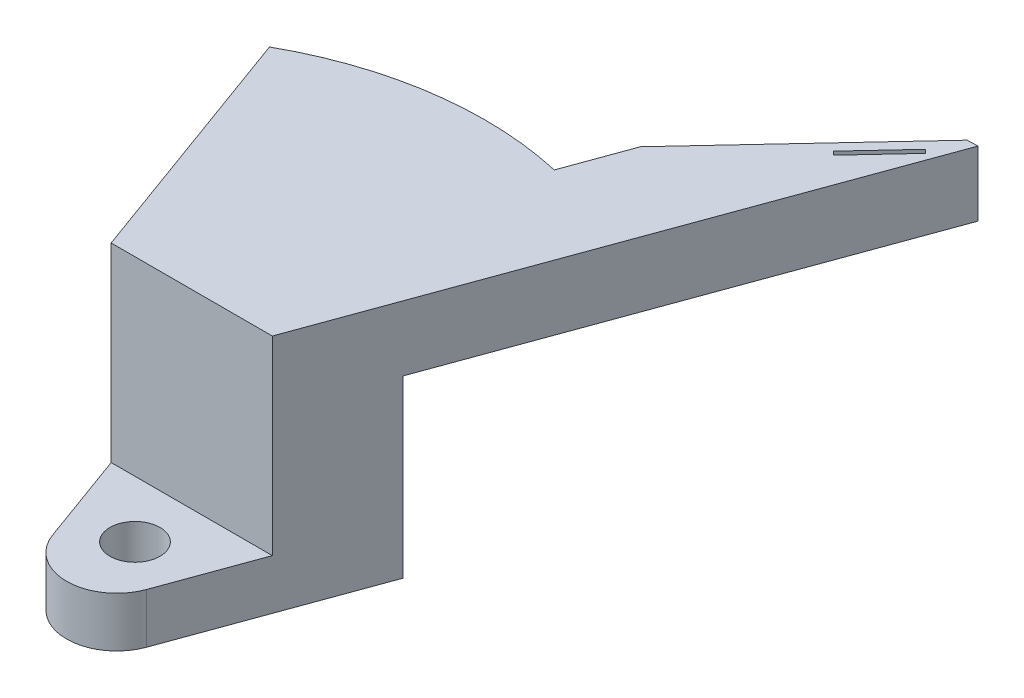
ISO-10303-21;
HEADER;
FILE_DESCRIPTION(('STEP AP214'),'2;1');
FILE_NAME('part.step','',(''),(''),'','','');
FILE_SCHEMA(('AUTOMOTIVE_DESIGN { 1 0 10303 214 1 1 1 1 }'));
ENDSEC;
DATA;
#1=APPLICATION_CONTEXT('core data for automotive mechanical design processes');
#2=APPLICATION_PROTOCOL_DEFINITION('international standard','automotive_design',2000,#1);
#3=PRODUCT_CONTEXT('',#1,'mechanical');
#4=PRODUCT('Part','Part','',(#3));
#5=PRODUCT_RELATED_PRODUCT_CATEGORY('part','',(#4));
#6=PRODUCT_DEFINITION_FORMATION('','',#4);
#7=PRODUCT_DEFINITION_CONTEXT('part definition',#1,'design');
#8=PRODUCT_DEFINITION('design','',#6,#7);
#9=PRODUCT_DEFINITION_SHAPE('','',#8);
#10=(LENGTH_UNIT() NAMED_UNIT(*) SI_UNIT(.MILLI.,.METRE.));
#11=(NAMED_UNIT(*) PLANE_ANGLE_UNIT() SI_UNIT($,.RADIAN.));
#12=(NAMED_UNIT(*) SI_UNIT($,.STERADIAN.) SOLID_ANGLE_UNIT());
#13=UNCERTAINTY_MEASURE_WITH_UNIT(LENGTH_MEASURE(1.E-05),#10,'distance_accuracy_value','');
#14=(GEOMETRIC_REPRESENTATION_CONTEXT(3) GLOBAL_UNCERTAINTY_ASSIGNED_CONTEXT((#13)) GLOBAL_UNIT_ASSIGNED_CONTEXT((#10,
#11,#12)) REPRESENTATION_CONTEXT('',''));
#15=CARTESIAN_POINT('',(0.,0.,0.));
#16=DIRECTION('',(0.,0.,1.));
#17=DIRECTION('',(1.,0.,0.));
#18=AXIS2_PLACEMENT_3D('',#15,#16,#17);
#19=CARTESIAN_POINT('',(-10.5718368385246,48.,3.84783393074178));
#20=DIRECTION('',(0.939692620785911,0.,-0.342020143325663));
#21=DIRECTION('',(-0.342020143325663,0.,-0.939692620785911));
#22=AXIS2_PLACEMENT_3D('',#19,#20,#21);
#23=PLANE('',#22);
#24=DIRECTION('',(0.,-1.,0.));
#25=VECTOR('',#24,1.);
#26=CARTESIAN_POINT('',(-23.0613730998364,48.,-30.4668849266728));
#27=LINE('',#26,#25);
#28=CARTESIAN_POINT('',(-23.0613730998364,35.,-30.4668849266728));
#29=VERTEX_POINT('',#28);
#30=CARTESIAN_POINT('',(-23.0613730998364,0.,-30.4668849266728));
#31=VERTEX_POINT('',#30);
#32=EDGE_CURVE('E151',#29,#31,#27,.T.);
#33=ORIENTED_EDGE('',*,*,#32,.T.);
#34=DIRECTION('',(0.342020143325663,0.,0.939692620785911));
#35=VECTOR('',#34,1.);
#36=CARTESIAN_POINT('',(-10.5718368385246,0.,3.84783393074178));
#37=LINE('',#36,#35);
#38=CARTESIAN_POINT('',(-9.39692620785914,0.,7.07587435837231));
#39=VERTEX_POINT('',#38);
#40=EDGE_CURVE('E155',#31,#39,#37,.T.);
#41=ORIENTED_EDGE('',*,*,#40,.T.);
#42=DIRECTION('',(0.,-1.,0.));
#43=VECTOR('',#42,1.);
#44=CARTESIAN_POINT('',(-9.39692620785914,48.,7.07587435837231));
#45=LINE('',#44,#43);
#46=CARTESIAN_POINT('',(-9.39692620785914,10.,7.07587435837231));
#47=VERTEX_POINT('',#46);
#48=EDGE_CURVE('E189',#47,#39,#45,.T.);
#49=ORIENTED_EDGE('',*,*,#48,.F.);
#50=DIRECTION('',(-0.342020143325663,0.,-0.939692620785911));
#51=VECTOR('',#50,1.);
#52=CARTESIAN_POINT('',(-10.5718368385246,10.,3.84783393074179));
#53=LINE('',#52,#51);
#54=CARTESIAN_POINT('',(-16.101331238752,10.,-11.3443270748843));
#55=VERTEX_POINT('',#54);
#56=EDGE_CURVE('E162',#47,#55,#53,.T.);
#57=ORIENTED_EDGE('',*,*,#56,.T.);
#58=DIRECTION('',(0.,1.,0.));
#59=VECTOR('',#58,1.);
#60=CARTESIAN_POINT('',(-16.101331238752,48.,-11.3443270748843));
#61=LINE('',#60,#59);
#62=CARTESIAN_POINT('',(-16.101331238752,48.,-11.3443270748843));
#63=VERTEX_POINT('',#62);
#64=EDGE_CURVE('E248',#55,#63,#61,.T.);
#65=ORIENTED_EDGE('',*,*,#64,.T.);
#66=DIRECTION('',(0.342020143325663,0.,0.939692620785911));
#67=VECTOR('',#66,1.);
#68=CARTESIAN_POINT('',(-10.5718368385246,48.,3.84783393074178));
#69=LINE('',#68,#67);
#70=CARTESIAN_POINT('',(-34.2020143325663,48.,-61.075545151844));
#71=VERTEX_POINT('',#70);
#72=EDGE_CURVE('E193',#71,#63,#69,.T.);
#73=ORIENTED_EDGE('',*,*,#72,.F.);
#74=DIRECTION('',(0.,-1.,0.));
#75=VECTOR('',#74,1.);
#76=CARTESIAN_POINT('',(-34.2020143325663,48.,-61.075545151844));
#77=LINE('',#76,#75);
#78=CARTESIAN_POINT('',(-34.2020143325663,35.,-61.075545151844));
#79=VERTEX_POINT('',#78);
#80=EDGE_CURVE('E192',#71,#79,#77,.T.);
#81=ORIENTED_EDGE('',*,*,#80,.T.);
#82=DIRECTION('',(0.342020143325663,0.,0.939692620785911));
#83=VECTOR('',#82,1.);
#84=CARTESIAN_POINT('',(-10.5718368385246,35.,3.84783393074178));
#85=LINE('',#84,#83);
#86=EDGE_CURVE('E158',#79,#29,#85,.T.);
#87=ORIENTED_EDGE('',*,*,#86,.T.);
#88=EDGE_LOOP('',(#33,#41,#49,#57,#65,#73,#81,#87));
#89=FACE_BOUND('',#88,.T.);
#90=ADVANCED_FACE('F42',(#89),#23,.F.);
#91=CARTESIAN_POINT('',(0.,48.,0.));
#92=DIRECTION('',(0.,-1.,0.));
#93=DIRECTION('',(0.,0.,-1.));
#94=AXIS2_PLACEMENT_3D('',#91,#92,#93);
#95=CYLINDRICAL_SURFACE('',#94,5.);
#96=CARTESIAN_POINT('',(0.,10.,0.));
#97=DIRECTION('',(0.,-1.,0.));
#98=DIRECTION('',(0.,0.,-1.));
#99=AXIS2_PLACEMENT_3D('',#96,#97,#98);
#100=CIRCLE('',#99,5.);
#101=CARTESIAN_POINT('',(0.,10.,-5.));
#102=VERTEX_POINT('',#101);
#103=EDGE_CURVE('E270',#102,#102,#100,.T.);
#104=ORIENTED_EDGE('',*,*,#103,.F.);
#105=EDGE_LOOP('',(#104));
#106=FACE_BOUND('',#105,.T.);
#107=CARTESIAN_POINT('',(0.,2.,0.));
#108=DIRECTION('',(0.,-1.,0.));
#109=DIRECTION('',(0.,0.,-1.));
#110=AXIS2_PLACEMENT_3D('',#107,#108,#109);
#111=CIRCLE('',#110,5.);
#112=CARTESIAN_POINT('',(0.,2.,-5.));
#113=VERTEX_POINT('',#112);
#114=EDGE_CURVE('E47',#113,#113,#111,.T.);
#115=ORIENTED_EDGE('',*,*,#114,.T.);
#116=EDGE_LOOP('',(#115));
#117=FACE_BOUND('',#116,.T.);
#118=ADVANCED_FACE('F359',(#106,#117),#95,.F.);
#119=CARTESIAN_POINT('',(0.,48.,3.6556729251157));
#120=DIRECTION('',(0.,-1.,0.));
#121=DIRECTION('',(0.,0.,-1.));
#122=AXIS2_PLACEMENT_3D('',#119,#120,#121);
#123=CYLINDRICAL_SURFACE('',#122,10.);
#124=CARTESIAN_POINT('',(0.,10.,3.6556729251157));
#125=DIRECTION('',(0.,-1.,0.));
#126=DIRECTION('',(0.,0.,-1.));
#127=AXIS2_PLACEMENT_3D('',#124,#125,#126);
#128=CIRCLE('',#127,10.);
#129=CARTESIAN_POINT('',(9.39692620785914,10.,7.07587435837231));
#130=VERTEX_POINT('',#129);
#131=EDGE_CURVE('E264',#47,#130,#128,.F.);
#132=ORIENTED_EDGE('',*,*,#131,.F.);
#133=ORIENTED_EDGE('',*,*,#48,.T.);
#134=CARTESIAN_POINT('',(0.,0.,3.6556729251157));
#135=DIRECTION('',(0.,1.,0.));
#136=DIRECTION('',(0.,0.,1.));
#137=AXIS2_PLACEMENT_3D('',#134,#135,#136);
#138=CIRCLE('',#137,10.);
#139=CARTESIAN_POINT('',(9.39692620785914,0.,7.07587435837231));
#140=VERTEX_POINT('',#139);
#141=EDGE_CURVE('E177',#140,#39,#138,.F.);
#142=ORIENTED_EDGE('',*,*,#141,.F.);
#143=DIRECTION('',(0.,-1.,0.));
#144=VECTOR('',#143,1.);
#145=CARTESIAN_POINT('',(9.39692620785914,48.,7.07587435837231));
#146=LINE('',#145,#144);
#147=EDGE_CURVE('E196',#130,#140,#146,.T.);
#148=ORIENTED_EDGE('',*,*,#147,.F.);
#149=EDGE_LOOP('',(#132,#133,#142,#148));
#150=FACE_BOUND('',#149,.T.);
#151=ADVANCED_FACE('F393',(#150),#123,.T.);
#152=CARTESIAN_POINT('',(10.5718368385246,48.,3.84783393074178));
#153=DIRECTION('',(0.939692620785911,0.,0.342020143325663));
#154=DIRECTION('',(0.342020143325663,0.,-0.939692620785911));
#155=AXIS2_PLACEMENT_3D('',#152,#153,#154);
#156=PLANE('',#155);
#157=DIRECTION('',(-0.342020143325663,0.,0.939692620785911));
#158=VECTOR('',#157,1.);
#159=CARTESIAN_POINT('',(10.5718368385246,0.,3.84783393074178));
#160=LINE('',#159,#158);
#161=CARTESIAN_POINT('',(23.0613730998364,0.,-30.4668849266728));
#162=VERTEX_POINT('',#161);
#163=EDGE_CURVE('E180',#162,#140,#160,.T.);
#164=ORIENTED_EDGE('',*,*,#163,.F.);
#165=DIRECTION('',(0.,-1.,0.));
#166=VECTOR('',#165,1.);
#167=CARTESIAN_POINT('',(23.0613730998364,48.,-30.4668849266728));
#168=LINE('',#167,#166);
#169=CARTESIAN_POINT('',(23.0613730998364,35.,-30.4668849266728));
#170=VERTEX_POINT('',#169);
#171=EDGE_CURVE('E169',#170,#162,#168,.T.);
#172=ORIENTED_EDGE('',*,*,#171,.F.);
#173=DIRECTION('',(-0.342020143325663,0.,0.939692620785911));
#174=VECTOR('',#173,1.);
#175=CARTESIAN_POINT('',(10.5718368385246,35.,3.84783393074178));
#176=LINE('',#175,#174);
#177=CARTESIAN_POINT('',(53.7302655766085,35.,-114.728974486288));
#178=VERTEX_POINT('',#177);
#179=EDGE_CURVE('E231',#178,#170,#176,.T.);
#180=ORIENTED_EDGE('',*,*,#179,.F.);
#181=DIRECTION('',(0.,1.,0.));
#182=VECTOR('',#181,1.);
#183=CARTESIAN_POINT('',(53.7302655766085,48.,-114.728974486288));
#184=LINE('',#183,#182);
#185=CARTESIAN_POINT('',(53.7302655766085,48.,-114.728974486288));
#186=VERTEX_POINT('',#185);
#187=EDGE_CURVE('E205',#178,#186,#184,.T.);
#188=ORIENTED_EDGE('',*,*,#187,.T.);
#189=DIRECTION('',(-0.342020143325663,0.,0.939692620785911));
#190=VECTOR('',#189,1.);
#191=CARTESIAN_POINT('',(10.5718368385246,48.,3.84783393074178));
#192=LINE('',#191,#190);
#193=CARTESIAN_POINT('',(16.101331238752,48.,-11.3443270748843));
#194=VERTEX_POINT('',#193);
#195=EDGE_CURVE('E179',#186,#194,#192,.T.);
#196=ORIENTED_EDGE('',*,*,#195,.T.);
#197=DIRECTION('',(0.,1.,0.));
#198=VECTOR('',#197,1.);
#199=CARTESIAN_POINT('',(16.101331238752,48.,-11.3443270748843));
#200=LINE('',#199,#198);
#201=CARTESIAN_POINT('',(16.101331238752,10.,-11.3443270748843));
#202=VERTEX_POINT('',#201);
#203=EDGE_CURVE('E250',#202,#194,#200,.T.);
#204=ORIENTED_EDGE('',*,*,#203,.F.);
#205=DIRECTION('',(0.342020143325663,0.,-0.939692620785911));
#206=VECTOR('',#205,1.);
#207=CARTESIAN_POINT('',(10.5718368385246,10.,3.84783393074179));
#208=LINE('',#207,#206);
#209=EDGE_CURVE('E267',#130,#202,#208,.T.);
#210=ORIENTED_EDGE('',*,*,#209,.F.);
#211=ORIENTED_EDGE('',*,*,#147,.T.);
#212=EDGE_LOOP('',(#164,#172,#180,#188,#196,#204,#210,#211));
#213=FACE_BOUND('',#212,.T.);
#214=ADVANCED_FACE('F236',(#213),#156,.T.);
#215=CARTESIAN_POINT('',(0.,48.,0.));
#216=DIRECTION('',(0.,-1.,0.));
#217=DIRECTION('',(0.,0.,-1.));
#218=AXIS2_PLACEMENT_3D('',#215,#216,#217);
#219=CYLINDRICAL_SURFACE('',#218,70.0000000000001);
#220=DIRECTION('',(0.,1.,0.));
#221=VECTOR('',#220,1.);
#222=CARTESIAN_POINT('',(15.5316293120258,35.,-68.2551718986468));
#223=LINE('',#222,#221);
#224=CARTESIAN_POINT('',(15.5316293120258,35.,-68.2551718986468));
#225=VERTEX_POINT('',#224);
#226=CARTESIAN_POINT('',(15.5316293120258,48.,-68.2551718986469));
#227=VERTEX_POINT('',#226);
#228=EDGE_CURVE('E284',#225,#227,#223,.T.);
#229=ORIENTED_EDGE('',*,*,#228,.F.);
#230=CARTESIAN_POINT('',(0.,35.,0.));
#231=DIRECTION('',(0.,1.,0.));
#232=DIRECTION('',(0.,0.,1.));
#233=AXIS2_PLACEMENT_3D('',#230,#231,#232);
#234=CIRCLE('',#233,70.0000000000001);
#235=EDGE_CURVE('E258',#225,#79,#234,.T.);
#236=ORIENTED_EDGE('',*,*,#235,.T.);
#237=ORIENTED_EDGE('',*,*,#80,.F.);
#238=CARTESIAN_POINT('',(0.,48.,0.));
#239=DIRECTION('',(0.,1.,0.));
#240=DIRECTION('',(0.,0.,1.));
#241=AXIS2_PLACEMENT_3D('',#238,#239,#240);
#242=CIRCLE('',#241,70.0000000000001);
#243=EDGE_CURVE('E184',#227,#71,#242,.T.);
#244=ORIENTED_EDGE('',*,*,#243,.F.);
#245=EDGE_LOOP('',(#229,#236,#237,#244));
#246=FACE_BOUND('',#245,.T.);
#247=ADVANCED_FACE('F298',(#246),#219,.T.);
#248=CARTESIAN_POINT('',(0.,48.,0.));
#249=DIRECTION('',(0.,1.,0.));
#250=DIRECTION('',(0.,0.,1.));
#251=AXIS2_PLACEMENT_3D('',#248,#249,#250);
#252=PLANE('',#251);
#253=DIRECTION('',(0.681998360062494,0.,-0.731353701619174));
#254=VECTOR('',#253,1.);
#255=CARTESIAN_POINT('',(49.7661287671586,48.,-108.223290792057));
#256=LINE('',#255,#254);
#257=CARTESIAN_POINT('',(40.9001500863462,48.,-98.7156926710073));
#258=VERTEX_POINT('',#257);
#259=CARTESIAN_POINT('',(49.7661287671586,48.,-108.223290792057));
#260=VERTEX_POINT('',#259);
#261=EDGE_CURVE('E60',#258,#260,#256,.T.);
#262=ORIENTED_EDGE('',*,*,#261,.F.);
#263=DIRECTION('',(0.731353701619171,0.,0.681998360062498));
#264=VECTOR('',#263,1.);
#265=CARTESIAN_POINT('',(40.9001500863462,48.,-98.7156926710073));
#266=LINE('',#265,#264);
#267=CARTESIAN_POINT('',(40.168796384727,48.,-99.3976910310698));
#268=VERTEX_POINT('',#267);
#269=EDGE_CURVE('E325',#268,#258,#266,.T.);
#270=ORIENTED_EDGE('',*,*,#269,.F.);
#271=DIRECTION('',(-0.681998360062494,0.,0.731353701619175));
#272=VECTOR('',#271,1.);
#273=CARTESIAN_POINT('',(49.0347750655395,48.,-108.905289152119));
#274=LINE('',#273,#272);
#275=CARTESIAN_POINT('',(49.0347750655395,48.,-108.905289152119));
#276=VERTEX_POINT('',#275);
#277=EDGE_CURVE('E336',#276,#268,#274,.T.);
#278=ORIENTED_EDGE('',*,*,#277,.F.);
#279=DIRECTION('',(-0.731353701619084,0.,-0.681998360062592));
#280=VECTOR('',#279,1.);
#281=CARTESIAN_POINT('',(49.7661287671586,48.,-108.223290792057));
#282=LINE('',#281,#280);
#283=EDGE_CURVE('E340',#260,#276,#282,.T.);
#284=ORIENTED_EDGE('',*,*,#283,.F.);
#285=EDGE_LOOP('',(#262,#270,#278,#284));
#286=FACE_BOUND('',#285,.T.);
#287=ORIENTED_EDGE('',*,*,#195,.F.);
#288=DIRECTION('',(0.999390827019096,0.,-0.0348994967024912));
#289=VECTOR('',#288,1.);
#290=CARTESIAN_POINT('',(-3.93610223498503,48.,-112.715220548513));
#291=LINE('',#290,#289);
#292=CARTESIAN_POINT('',(51.6244636705483,48.,-114.655438263331));
#293=VERTEX_POINT('',#292);
#294=EDGE_CURVE('E209',#186,#293,#291,.F.);
#295=ORIENTED_EDGE('',*,*,#294,.T.);
#296=DIRECTION('',(-0.681998360062494,0.,0.731353701619174));
#297=VECTOR('',#296,1.);
#298=CARTESIAN_POINT('',(-29.5752695815727,48.,-27.5793850614045));
#299=LINE('',#298,#297);
#300=CARTESIAN_POINT('',(20.1256237788797,48.,-80.8770679614277));
#301=VERTEX_POINT('',#300);
#302=EDGE_CURVE('E221',#293,#301,#299,.T.);
#303=ORIENTED_EDGE('',*,*,#302,.T.);
#304=DIRECTION('',(-0.342020143325662,0.,0.939692620785911));
#305=VECTOR('',#304,1.);
#306=CARTESIAN_POINT('',(-8.22201557719362,48.,-2.99256893577146));
#307=LINE('',#306,#305);
#308=EDGE_CURVE('E275',#301,#227,#307,.T.);
#309=ORIENTED_EDGE('',*,*,#308,.T.);
#310=ORIENTED_EDGE('',*,*,#243,.T.);
#311=ORIENTED_EDGE('',*,*,#72,.T.);
#312=DIRECTION('',(-1.,0.,0.));
#313=VECTOR('',#312,1.);
#314=CARTESIAN_POINT('',(0.,48.,-11.3443270748843));
#315=LINE('',#314,#313);
#316=EDGE_CURVE('E163',#194,#63,#315,.T.);
#317=ORIENTED_EDGE('',*,*,#316,.F.);
#318=EDGE_LOOP('',(#287,#295,#303,#309,#310,#311,#317));
#319=FACE_BOUND('',#318,.T.);
#320=ADVANCED_FACE('F241',(#286,#319),#252,.T.);
#321=CARTESIAN_POINT('',(0.,0.,0.));
#322=DIRECTION('',(0.,1.,0.));
#323=DIRECTION('',(0.,0.,1.));
#324=AXIS2_PLACEMENT_3D('',#321,#322,#323);
#325=PLANE('',#324);
#326=CARTESIAN_POINT('',(0.,0.,0.));
#327=DIRECTION('',(0.,-1.,0.));
#328=DIRECTION('',(0.,0.,-1.));
#329=AXIS2_PLACEMENT_3D('',#326,#327,#328);
#330=CIRCLE('',#329,6.5);
#331=CARTESIAN_POINT('',(0.,0.,-6.5));
#332=VERTEX_POINT('',#331);
#333=EDGE_CURVE('E308',#332,#332,#330,.T.);
#334=ORIENTED_EDGE('',*,*,#333,.F.);
#335=EDGE_LOOP('',(#334));
#336=FACE_BOUND('',#335,.T.);
#337=ORIENTED_EDGE('',*,*,#40,.F.);
#338=DIRECTION('',(1.,0.,0.));
#339=VECTOR('',#338,1.);
#340=CARTESIAN_POINT('',(-48.3561043718012,0.,-30.4668849266728));
#341=LINE('',#340,#339);
#342=EDGE_CURVE('E166',#31,#162,#341,.T.);
#343=ORIENTED_EDGE('',*,*,#342,.T.);
#344=ORIENTED_EDGE('',*,*,#163,.T.);
#345=ORIENTED_EDGE('',*,*,#141,.T.);
#346=EDGE_LOOP('',(#337,#343,#344,#345));
#347=FACE_BOUND('',#346,.T.);
#348=ADVANCED_FACE('F175',(#336,#347),#325,.F.);
#349=CARTESIAN_POINT('',(-8.22201557719362,35.,-2.99256893577146));
#350=DIRECTION('',(-0.939692620785911,0.,-0.342020143325662));
#351=DIRECTION('',(-0.342020143325662,0.,0.939692620785911));
#352=AXIS2_PLACEMENT_3D('',#349,#350,#351);
#353=PLANE('',#352);
#354=ORIENTED_EDGE('',*,*,#308,.F.);
#355=DIRECTION('',(0.,1.,0.));
#356=VECTOR('',#355,1.);
#357=CARTESIAN_POINT('',(20.1256237788797,35.,-80.8770679614277));
#358=LINE('',#357,#356);
#359=CARTESIAN_POINT('',(20.1256237788797,35.,-80.8770679614277));
#360=VERTEX_POINT('',#359);
#361=EDGE_CURVE('E279',#360,#301,#358,.T.);
#362=ORIENTED_EDGE('',*,*,#361,.F.);
#363=DIRECTION('',(-0.342020143325662,0.,0.939692620785911));
#364=VECTOR('',#363,1.);
#365=CARTESIAN_POINT('',(-8.22201557719362,35.,-2.99256893577146));
#366=LINE('',#365,#364);
#367=EDGE_CURVE('E229',#360,#225,#366,.T.);
#368=ORIENTED_EDGE('',*,*,#367,.T.);
#369=ORIENTED_EDGE('',*,*,#228,.T.);
#370=EDGE_LOOP('',(#354,#362,#368,#369));
#371=FACE_BOUND('',#370,.T.);
#372=ADVANCED_FACE('F375',(#371),#353,.T.);
#373=CARTESIAN_POINT('',(-29.5752695815727,35.,-27.5793850614045));
#374=DIRECTION('',(-0.731353701619174,0.,-0.681998360062494));
#375=DIRECTION('',(-0.681998360062494,0.,0.731353701619174));
#376=AXIS2_PLACEMENT_3D('',#373,#374,#375);
#377=PLANE('',#376);
#378=ORIENTED_EDGE('',*,*,#302,.F.);
#379=DIRECTION('',(0.,-1.,0.));
#380=VECTOR('',#379,1.);
#381=CARTESIAN_POINT('',(51.6244636705483,35.,-114.655438263331));
#382=LINE('',#381,#380);
#383=CARTESIAN_POINT('',(51.6244636705483,35.,-114.655438263331));
#384=VERTEX_POINT('',#383);
#385=EDGE_CURVE('E53',#293,#384,#382,.T.);
#386=ORIENTED_EDGE('',*,*,#385,.T.);
#387=DIRECTION('',(-0.681998360062494,0.,0.731353701619174));
#388=VECTOR('',#387,1.);
#389=CARTESIAN_POINT('',(-29.5752695815727,35.,-27.5793850614045));
#390=LINE('',#389,#388);
#391=EDGE_CURVE('E219',#384,#360,#390,.T.);
#392=ORIENTED_EDGE('',*,*,#391,.T.);
#393=ORIENTED_EDGE('',*,*,#361,.T.);
#394=EDGE_LOOP('',(#378,#386,#392,#393));
#395=FACE_BOUND('',#394,.T.);
#396=ADVANCED_FACE('F217',(#395),#377,.T.);
#397=CARTESIAN_POINT('',(0.,35.,0.));
#398=DIRECTION('',(0.,1.,0.));
#399=DIRECTION('',(0.,0.,1.));
#400=AXIS2_PLACEMENT_3D('',#397,#398,#399);
#401=PLANE('',#400);
#402=DIRECTION('',(-0.731353701619171,0.,-0.681998360062498));
#403=VECTOR('',#402,1.);
#404=CARTESIAN_POINT('',(40.9001500863462,35.,-98.7156926710073));
#405=LINE('',#404,#403);
#406=CARTESIAN_POINT('',(40.9001500863462,35.,-98.7156926710073));
#407=VERTEX_POINT('',#406);
#408=CARTESIAN_POINT('',(40.168796384727,35.,-99.3976910310698));
#409=VERTEX_POINT('',#408);
#410=EDGE_CURVE('E350',#407,#409,#405,.T.);
#411=ORIENTED_EDGE('',*,*,#410,.F.);
#412=DIRECTION('',(-0.681998360062494,0.,0.731353701619175));
#413=VECTOR('',#412,1.);
#414=CARTESIAN_POINT('',(49.7661287671586,35.,-108.223290792057));
#415=LINE('',#414,#413);
#416=CARTESIAN_POINT('',(49.7661287671586,35.,-108.223290792057));
#417=VERTEX_POINT('',#416);
#418=EDGE_CURVE('E346',#417,#407,#415,.T.);
#419=ORIENTED_EDGE('',*,*,#418,.F.);
#420=DIRECTION('',(0.731353701619084,0.,0.681998360062592));
#421=VECTOR('',#420,1.);
#422=CARTESIAN_POINT('',(49.7661287671586,35.,-108.223290792057));
#423=LINE('',#422,#421);
#424=CARTESIAN_POINT('',(49.0347750655395,35.,-108.905289152119));
#425=VERTEX_POINT('',#424);
#426=EDGE_CURVE('E313',#425,#417,#423,.T.);
#427=ORIENTED_EDGE('',*,*,#426,.F.);
#428=DIRECTION('',(0.681998360062494,0.,-0.731353701619175));
#429=VECTOR('',#428,1.);
#430=CARTESIAN_POINT('',(49.0347750655395,35.,-108.905289152119));
#431=LINE('',#430,#429);
#432=EDGE_CURVE('E68',#409,#425,#431,.T.);
#433=ORIENTED_EDGE('',*,*,#432,.F.);
#434=EDGE_LOOP('',(#411,#419,#427,#433));
#435=FACE_BOUND('',#434,.T.);
#436=ORIENTED_EDGE('',*,*,#391,.F.);
#437=DIRECTION('',(-0.999390827019096,0.,0.0348994967024912));
#438=VECTOR('',#437,1.);
#439=CARTESIAN_POINT('',(53.7302655766085,35.,-114.728974486288));
#440=LINE('',#439,#438);
#441=EDGE_CURVE('E11',#384,#178,#440,.F.);
#442=ORIENTED_EDGE('',*,*,#441,.T.);
#443=ORIENTED_EDGE('',*,*,#179,.T.);
#444=DIRECTION('',(1.,0.,0.));
#445=VECTOR('',#444,1.);
#446=CARTESIAN_POINT('',(-34.2020143325663,35.,-30.4668849266728));
#447=LINE('',#446,#445);
#448=EDGE_CURVE('E303',#29,#170,#447,.T.);
#449=ORIENTED_EDGE('',*,*,#448,.F.);
#450=ORIENTED_EDGE('',*,*,#86,.F.);
#451=ORIENTED_EDGE('',*,*,#235,.F.);
#452=ORIENTED_EDGE('',*,*,#367,.F.);
#453=EDGE_LOOP('',(#436,#442,#443,#449,#450,#451,#452));
#454=FACE_BOUND('',#453,.T.);
#455=ADVANCED_FACE('F226',(#435,#454),#401,.F.);
#456=CARTESIAN_POINT('',(-34.2020143325663,48.,-11.3443270748843));
#457=DIRECTION('',(0.,0.,-1.));
#458=DIRECTION('',(0.,1.,0.));
#459=AXIS2_PLACEMENT_3D('',#456,#457,#458);
#460=PLANE('',#459);
#461=ORIENTED_EDGE('',*,*,#203,.T.);
#462=ORIENTED_EDGE('',*,*,#316,.T.);
#463=ORIENTED_EDGE('',*,*,#64,.F.);
#464=DIRECTION('',(1.,0.,0.));
#465=VECTOR('',#464,1.);
#466=CARTESIAN_POINT('',(-34.2020143325663,10.,-11.3443270748843));
#467=LINE('',#466,#465);
#468=EDGE_CURVE('E301',#55,#202,#467,.T.);
#469=ORIENTED_EDGE('',*,*,#468,.T.);
#470=EDGE_LOOP('',(#461,#462,#463,#469));
#471=FACE_BOUND('',#470,.T.);
#472=ADVANCED_FACE('F246',(#471),#460,.F.);
#473=CARTESIAN_POINT('',(-34.2020143325663,10.,13.6556729251157));
#474=DIRECTION('',(0.,-1.,0.));
#475=DIRECTION('',(0.,0.,-1.));
#476=AXIS2_PLACEMENT_3D('',#473,#474,#475);
#477=PLANE('',#476);
#478=ORIENTED_EDGE('',*,*,#103,.T.);
#479=EDGE_LOOP('',(#478));
#480=FACE_BOUND('',#479,.T.);
#481=ORIENTED_EDGE('',*,*,#209,.T.);
#482=ORIENTED_EDGE('',*,*,#468,.F.);
#483=ORIENTED_EDGE('',*,*,#56,.F.);
#484=ORIENTED_EDGE('',*,*,#131,.T.);
#485=EDGE_LOOP('',(#481,#482,#483,#484));
#486=FACE_BOUND('',#485,.T.);
#487=ADVANCED_FACE('F407',(#480,#486),#477,.F.);
#488=CARTESIAN_POINT('',(-34.2020143325663,35.,-30.4668849266728));
#489=DIRECTION('',(0.,0.,1.));
#490=DIRECTION('',(0.,-1.,0.));
#491=AXIS2_PLACEMENT_3D('',#488,#489,#490);
#492=PLANE('',#491);
#493=ORIENTED_EDGE('',*,*,#171,.T.);
#494=ORIENTED_EDGE('',*,*,#342,.F.);
#495=ORIENTED_EDGE('',*,*,#32,.F.);
#496=ORIENTED_EDGE('',*,*,#448,.T.);
#497=EDGE_LOOP('',(#493,#494,#495,#496));
#498=FACE_BOUND('',#497,.T.);
#499=ADVANCED_FACE('F167',(#498),#492,.F.);
#500=CARTESIAN_POINT('',(53.7302655766085,48.,-114.728974486288));
#501=DIRECTION('',(0.0348994967024912,0.,0.999390827019096));
#502=DIRECTION('',(0.,1.,0.));
#503=AXIS2_PLACEMENT_3D('',#500,#501,#502);
#504=PLANE('',#503);
#505=ORIENTED_EDGE('',*,*,#441,.F.);
#506=ORIENTED_EDGE('',*,*,#385,.F.);
#507=ORIENTED_EDGE('',*,*,#294,.F.);
#508=ORIENTED_EDGE('',*,*,#187,.F.);
#509=EDGE_LOOP('',(#505,#506,#507,#508));
#510=FACE_BOUND('',#509,.T.);
#511=ADVANCED_FACE('F45',(#510),#504,.F.);
#512=CARTESIAN_POINT('',(0.,2.,0.));
#513=DIRECTION('',(0.,-1.,0.));
#514=DIRECTION('',(0.,0.,-1.));
#515=AXIS2_PLACEMENT_3D('',#512,#513,#514);
#516=CYLINDRICAL_SURFACE('',#515,6.5);
#517=CARTESIAN_POINT('',(0.,2.,0.));
#518=DIRECTION('',(0.,-1.,0.));
#519=DIRECTION('',(0.,0.,-1.));
#520=AXIS2_PLACEMENT_3D('',#517,#518,#519);
#521=CIRCLE('',#520,6.5);
#522=CARTESIAN_POINT('',(0.,2.,-6.5));
#523=VERTEX_POINT('',#522);
#524=EDGE_CURVE('E312',#523,#523,#521,.T.);
#525=ORIENTED_EDGE('',*,*,#524,.F.);
#526=EDGE_LOOP('',(#525));
#527=FACE_BOUND('',#526,.T.);
#528=ORIENTED_EDGE('',*,*,#333,.T.);
#529=EDGE_LOOP('',(#528));
#530=FACE_BOUND('',#529,.T.);
#531=ADVANCED_FACE('F365',(#527,#530),#516,.F.);
#532=CARTESIAN_POINT('',(0.,2.,0.));
#533=DIRECTION('',(0.,-1.,0.));
#534=DIRECTION('',(0.,0.,-1.));
#535=AXIS2_PLACEMENT_3D('',#532,#533,#534);
#536=PLANE('',#535);
#537=ORIENTED_EDGE('',*,*,#114,.F.);
#538=EDGE_LOOP('',(#537));
#539=FACE_BOUND('',#538,.T.);
#540=ORIENTED_EDGE('',*,*,#524,.T.);
#541=EDGE_LOOP('',(#540));
#542=FACE_BOUND('',#541,.T.);
#543=ADVANCED_FACE('F361',(#539,#542),#536,.T.);
#544=CARTESIAN_POINT('',(49.7661287671586,-0.001000000000001,-108.223290792057));
#545=DIRECTION('',(0.731353701619175,0.,0.681998360062494));
#546=DIRECTION('',(0.681998360062494,0.,-0.731353701619175));
#547=AXIS2_PLACEMENT_3D('',#544,#545,#546);
#548=PLANE('',#547);
#549=ORIENTED_EDGE('',*,*,#418,.T.);
#550=DIRECTION('',(0.,1.,0.));
#551=VECTOR('',#550,1.);
#552=CARTESIAN_POINT('',(40.9001500863462,-0.001000000000001,-98.7156926710073));
#553=LINE('',#552,#551);
#554=EDGE_CURVE('E320',#407,#258,#553,.T.);
#555=ORIENTED_EDGE('',*,*,#554,.T.);
#556=ORIENTED_EDGE('',*,*,#261,.T.);
#557=DIRECTION('',(0.,1.,0.));
#558=VECTOR('',#557,1.);
#559=CARTESIAN_POINT('',(49.7661287671586,-0.001000000000001,-108.223290792057));
#560=LINE('',#559,#558);
#561=EDGE_CURVE('E321',#417,#260,#560,.T.);
#562=ORIENTED_EDGE('',*,*,#561,.F.);
#563=EDGE_LOOP('',(#549,#555,#556,#562));
#564=FACE_BOUND('',#563,.T.);
#565=ADVANCED_FACE('F364',(#564),#548,.F.);
#566=CARTESIAN_POINT('',(40.9001500863462,-0.001000000000001,-98.7156926710073));
#567=DIRECTION('',(-0.681998360062498,0.,0.731353701619171));
#568=DIRECTION('',(0.731353701619171,0.,0.681998360062498));
#569=AXIS2_PLACEMENT_3D('',#566,#567,#568);
#570=PLANE('',#569);
#571=ORIENTED_EDGE('',*,*,#410,.T.);
#572=DIRECTION('',(0.,1.,0.));
#573=VECTOR('',#572,1.);
#574=CARTESIAN_POINT('',(40.168796384727,-0.001000000000001,-99.3976910310698));
#575=LINE('',#574,#573);
#576=EDGE_CURVE('E328',#409,#268,#575,.T.);
#577=ORIENTED_EDGE('',*,*,#576,.T.);
#578=ORIENTED_EDGE('',*,*,#269,.T.);
#579=ORIENTED_EDGE('',*,*,#554,.F.);
#580=EDGE_LOOP('',(#571,#577,#578,#579));
#581=FACE_BOUND('',#580,.T.);
#582=ADVANCED_FACE('F484',(#581),#570,.F.);
#583=CARTESIAN_POINT('',(49.0347750655395,-0.001000000000001,-108.905289152119));
#584=DIRECTION('',(-0.731353701619175,0.,-0.681998360062494));
#585=DIRECTION('',(-0.681998360062494,0.,0.731353701619175));
#586=AXIS2_PLACEMENT_3D('',#583,#584,#585);
#587=PLANE('',#586);
#588=ORIENTED_EDGE('',*,*,#432,.T.);
#589=DIRECTION('',(0.,1.,0.));
#590=VECTOR('',#589,1.);
#591=CARTESIAN_POINT('',(49.0347750655395,-0.001000000000001,-108.905289152119));
#592=LINE('',#591,#590);
#593=EDGE_CURVE('E324',#425,#276,#592,.T.);
#594=ORIENTED_EDGE('',*,*,#593,.T.);
#595=ORIENTED_EDGE('',*,*,#277,.T.);
#596=ORIENTED_EDGE('',*,*,#576,.F.);
#597=EDGE_LOOP('',(#588,#594,#595,#596));
#598=FACE_BOUND('',#597,.T.);
#599=ADVANCED_FACE('F492',(#598),#587,.F.);
#600=CARTESIAN_POINT('',(49.7661287671586,-0.001000000000001,-108.223290792057));
#601=DIRECTION('',(0.681998360062592,0.,-0.731353701619084));
#602=DIRECTION('',(-0.731353701619084,0.,-0.681998360062592));
#603=AXIS2_PLACEMENT_3D('',#600,#601,#602);
#604=PLANE('',#603);
#605=ORIENTED_EDGE('',*,*,#426,.T.);
#606=ORIENTED_EDGE('',*,*,#561,.T.);
#607=ORIENTED_EDGE('',*,*,#283,.T.);
#608=ORIENTED_EDGE('',*,*,#593,.F.);
#609=EDGE_LOOP('',(#605,#606,#607,#608));
#610=FACE_BOUND('',#609,.T.);
#611=ADVANCED_FACE('F500',(#610),#604,.F.);
#612=CLOSED_SHELL('',(#90,#118,#151,#214,#247,#320,#348,#372,#396,#455,#472,#487,#499,#511,#531,
#543,#565,#582,#599,#611));
#613=MANIFOLD_SOLID_BREP('B2',#612);
#614=ADVANCED_BREP_SHAPE_REPRESENTATION('',(#18,#613),#14);
#615=SHAPE_DEFINITION_REPRESENTATION(#9,#614);
ENDSEC;
END-ISO-10303-21;
